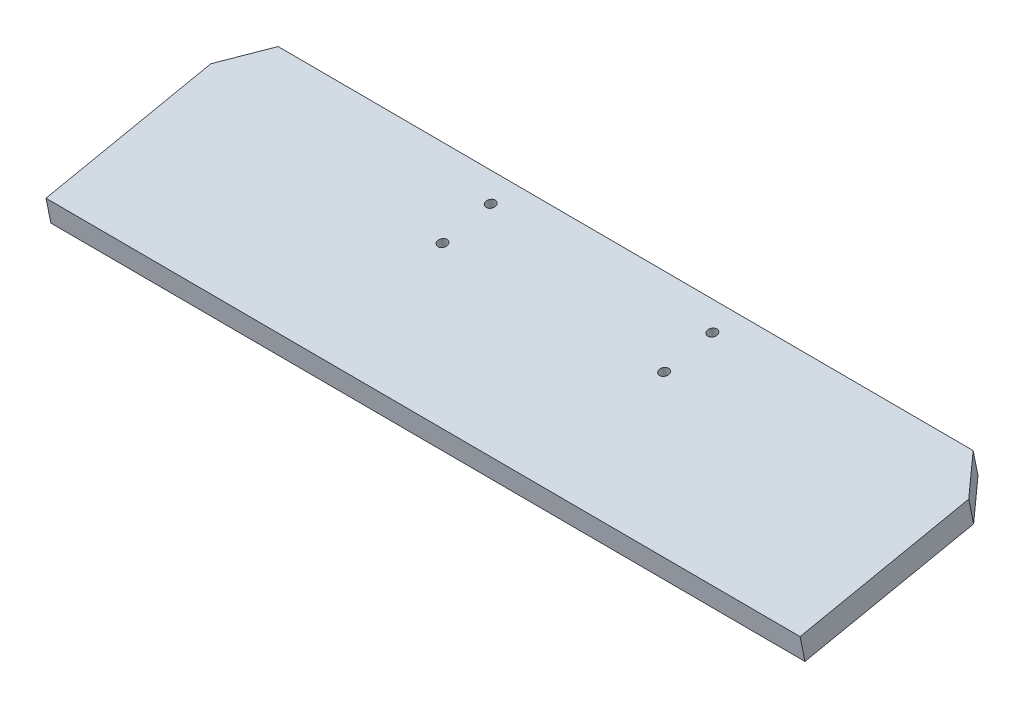
ISO-10303-21;
HEADER;
FILE_DESCRIPTION(('STEP AP214'),'2;1');
FILE_NAME('part.step','',(''),(''),'','','');
FILE_SCHEMA(('AUTOMOTIVE_DESIGN { 1 0 10303 214 1 1 1 1 }'));
ENDSEC;
DATA;
#1=APPLICATION_CONTEXT('core data for automotive mechanical design processes');
#2=APPLICATION_PROTOCOL_DEFINITION('international standard','automotive_design',2000,#1);
#3=PRODUCT_CONTEXT('',#1,'mechanical');
#4=PRODUCT('Part','Part','',(#3));
#5=PRODUCT_RELATED_PRODUCT_CATEGORY('part','',(#4));
#6=PRODUCT_DEFINITION_FORMATION('','',#4);
#7=PRODUCT_DEFINITION_CONTEXT('part definition',#1,'design');
#8=PRODUCT_DEFINITION('design','',#6,#7);
#9=PRODUCT_DEFINITION_SHAPE('','',#8);
#10=(LENGTH_UNIT() NAMED_UNIT(*) SI_UNIT(.MILLI.,.METRE.));
#11=(NAMED_UNIT(*) PLANE_ANGLE_UNIT() SI_UNIT($,.RADIAN.));
#12=(NAMED_UNIT(*) SI_UNIT($,.STERADIAN.) SOLID_ANGLE_UNIT());
#13=UNCERTAINTY_MEASURE_WITH_UNIT(LENGTH_MEASURE(1.E-05),#10,'distance_accuracy_value','');
#14=(GEOMETRIC_REPRESENTATION_CONTEXT(3) GLOBAL_UNCERTAINTY_ASSIGNED_CONTEXT((#13)) GLOBAL_UNIT_ASSIGNED_CONTEXT((#10,
#11,#12)) REPRESENTATION_CONTEXT('',''));
#15=CARTESIAN_POINT('',(0.,0.,0.));
#16=DIRECTION('',(0.,0.,1.));
#17=DIRECTION('',(1.,0.,0.));
#18=AXIS2_PLACEMENT_3D('',#15,#16,#17);
#19=CARTESIAN_POINT('',(97.422099153174,78.6378775801606,408.045001741372));
#20=DIRECTION('',(0.,0.202078468660463,-0.979369334063428));
#21=DIRECTION('',(0.,0.979369334063428,0.202078468660463));
#22=AXIS2_PLACEMENT_3D('',#19,#20,#21);
#23=PLANE('',#22);
#24=DIRECTION('',(0.999990097879295,-0.00435837437046662,-0.000899286497953613));
#25=VECTOR('',#24,1.);
#26=CARTESIAN_POINT('',(97.3938404806897,72.4189438900997,406.761816171762));
#27=LINE('',#26,#25);
#28=CARTESIAN_POINT('',(-97.0702765342321,73.266499706273,406.93669685822));
#29=VERTEX_POINT('',#28);
#30=CARTESIAN_POINT('',(97.3938404806897,72.4189438900997,406.761816171762));
#31=VERTEX_POINT('',#30);
#32=EDGE_CURVE('E119',#29,#31,#27,.T.);
#33=ORIENTED_EDGE('',*,*,#32,.T.);
#34=DIRECTION('',(-0.0044501846431965,-0.979359636230067,-0.202076467655074));
#35=VECTOR('',#34,1.);
#36=CARTESIAN_POINT('',(97.422099153174,78.6378775801606,408.045001741372));
#37=LINE('',#36,#35);
#38=CARTESIAN_POINT('',(97.422099153174,78.6378775801606,408.045001741372));
#39=VERTEX_POINT('',#38);
#40=EDGE_CURVE('E11',#39,#31,#37,.T.);
#41=ORIENTED_EDGE('',*,*,#40,.F.);
#42=DIRECTION('',(0.999990097879295,-0.00435837437046662,-0.000899286497953613));
#43=VECTOR('',#42,1.);
#44=CARTESIAN_POINT('',(97.422099153174,78.6378775801606,408.045001741372));
#45=LINE('',#44,#43);
#46=CARTESIAN_POINT('',(-97.0420178617478,79.4854333963339,408.219882427829));
#47=VERTEX_POINT('',#46);
#48=EDGE_CURVE('E130',#47,#39,#45,.T.);
#49=ORIENTED_EDGE('',*,*,#48,.F.);
#50=DIRECTION('',(-0.0044501846431965,-0.979359636230067,-0.202076467655074));
#51=VECTOR('',#50,1.);
#52=CARTESIAN_POINT('',(-97.0420178617478,79.4854333963339,408.219882427829));
#53=LINE('',#52,#51);
#54=EDGE_CURVE('E115',#47,#29,#53,.T.);
#55=ORIENTED_EDGE('',*,*,#54,.T.);
#56=EDGE_LOOP('',(#33,#41,#49,#55));
#57=FACE_BOUND('',#56,.T.);
#58=ADVANCED_FACE('F33',(#57),#23,.F.);
#59=CARTESIAN_POINT('',(97.422099153174,78.6378775801606,408.045001741372));
#60=DIRECTION('',(-0.999990097879295,0.00435837437046665,0.000899286497953456));
#61=DIRECTION('',(-0.00435837613281171,-0.999990502233639,0.));
#62=AXIS2_PLACEMENT_3D('',#59,#60,#61);
#63=PLANE('',#62);
#64=DIRECTION('',(0.,0.202078468660462,-0.979369334063428));
#65=VECTOR('',#64,1.);
#66=CARTESIAN_POINT('',(97.3938404806897,72.4189438900997,406.761816171762));
#67=LINE('',#66,#65);
#68=CARTESIAN_POINT('',(97.3938404806897,81.4013318220573,363.228849272643));
#69=VERTEX_POINT('',#68);
#70=EDGE_CURVE('E122',#31,#69,#67,.T.);
#71=ORIENTED_EDGE('',*,*,#70,.T.);
#72=DIRECTION('',(-0.0044501846431965,-0.979359636230067,-0.202076467655074));
#73=VECTOR('',#72,1.);
#74=CARTESIAN_POINT('',(97.422099153174,87.6202655121182,364.512034842252));
#75=LINE('',#74,#73);
#76=CARTESIAN_POINT('',(97.422099153174,87.6202655121182,364.512034842252));
#77=VERTEX_POINT('',#76);
#78=EDGE_CURVE('E42',#77,#69,#75,.T.);
#79=ORIENTED_EDGE('',*,*,#78,.F.);
#80=DIRECTION('',(0.,0.202078468660462,-0.979369334063428));
#81=VECTOR('',#80,1.);
#82=CARTESIAN_POINT('',(97.422099153174,78.6378775801606,408.045001741372));
#83=LINE('',#82,#81);
#84=EDGE_CURVE('E88',#39,#77,#83,.T.);
#85=ORIENTED_EDGE('',*,*,#84,.F.);
#86=ORIENTED_EDGE('',*,*,#40,.T.);
#87=EDGE_LOOP('',(#71,#79,#85,#86));
#88=FACE_BOUND('',#87,.T.);
#89=ADVANCED_FACE('F162',(#88),#63,.F.);
#90=CARTESIAN_POINT('',(97.422099153174,87.6202655121182,364.512034842252));
#91=DIRECTION('',(-0.757621319258177,-0.128591688377846,0.63990164422795));
#92=DIRECTION('',(0.645258825539128,0.,0.763964035844532));
#93=AXIS2_PLACEMENT_3D('',#90,#91,#92);
#94=PLANE('',#93);
#95=DIRECTION('',(-0.652679195671304,0.155945120486169,-0.74141148287197));
#96=VECTOR('',#95,1.);
#97=CARTESIAN_POINT('',(97.3938404806897,81.4013318220573,363.228849272643));
#98=LINE('',#97,#96);
#99=CARTESIAN_POINT('',(89.1048146956641,83.3818348522316,353.812923440169));
#100=VERTEX_POINT('',#99);
#101=EDGE_CURVE('E125',#69,#100,#98,.T.);
#102=ORIENTED_EDGE('',*,*,#101,.T.);
#103=DIRECTION('',(-0.0044501846431965,-0.979359636230067,-0.202076467655074));
#104=VECTOR('',#103,1.);
#105=CARTESIAN_POINT('',(89.1330733681484,89.6007685422925,355.096109009778));
#106=LINE('',#105,#104);
#107=CARTESIAN_POINT('',(89.1330733681484,89.6007685422925,355.096109009778));
#108=VERTEX_POINT('',#107);
#109=EDGE_CURVE('E110',#108,#100,#106,.T.);
#110=ORIENTED_EDGE('',*,*,#109,.F.);
#111=DIRECTION('',(-0.652679195671304,0.155945120486169,-0.74141148287197));
#112=VECTOR('',#111,1.);
#113=CARTESIAN_POINT('',(97.422099153174,87.6202655121182,364.512034842252));
#114=LINE('',#113,#112);
#115=EDGE_CURVE('E101',#77,#108,#114,.T.);
#116=ORIENTED_EDGE('',*,*,#115,.F.);
#117=ORIENTED_EDGE('',*,*,#78,.T.);
#118=EDGE_LOOP('',(#102,#110,#116,#117));
#119=FACE_BOUND('',#118,.T.);
#120=ADVANCED_FACE('F165',(#119),#94,.F.);
#121=CARTESIAN_POINT('',(89.1330733681484,89.6007685422925,355.096109009778));
#122=DIRECTION('',(0.,-0.202078468660463,0.979369334063428));
#123=DIRECTION('',(0.,-0.979369334063428,-0.202078468660463));
#124=AXIS2_PLACEMENT_3D('',#121,#122,#123);
#125=PLANE('',#124);
#126=DIRECTION('',(-0.999990097879295,0.00435837437046663,0.000899286497953437));
#127=VECTOR('',#126,1.);
#128=CARTESIAN_POINT('',(89.1048146956641,83.3818348522316,353.812923440169));
#129=LINE('',#128,#127);
#130=CARTESIAN_POINT('',(-90.1246620164566,84.1629917450757,353.974103684637));
#131=VERTEX_POINT('',#130);
#132=EDGE_CURVE('E109',#100,#131,#129,.T.);
#133=ORIENTED_EDGE('',*,*,#132,.T.);
#134=DIRECTION('',(-0.0044501846431965,-0.979359636230067,-0.202076467655074));
#135=VECTOR('',#134,1.);
#136=CARTESIAN_POINT('',(-90.0964033439723,90.3819254351366,355.257289254247));
#137=LINE('',#136,#135);
#138=CARTESIAN_POINT('',(-90.0964033439723,90.3819254351366,355.257289254247));
#139=VERTEX_POINT('',#138);
#140=EDGE_CURVE('E106',#139,#131,#137,.T.);
#141=ORIENTED_EDGE('',*,*,#140,.F.);
#142=DIRECTION('',(-0.999990097879295,0.00435837437046663,0.000899286497953437));
#143=VECTOR('',#142,1.);
#144=CARTESIAN_POINT('',(89.1330733681484,89.6007685422925,355.096109009778));
#145=LINE('',#144,#143);
#146=EDGE_CURVE('E95',#108,#139,#145,.T.);
#147=ORIENTED_EDGE('',*,*,#146,.F.);
#148=ORIENTED_EDGE('',*,*,#109,.T.);
#149=EDGE_LOOP('',(#133,#141,#147,#148));
#150=FACE_BOUND('',#149,.T.);
#151=ADVANCED_FACE('F107',(#150),#125,.F.);
#152=CARTESIAN_POINT('',(-97.0420178617478,88.2636224531486,365.676561371193));
#153=DIRECTION('',(0.837186908209258,-0.114166372615275,0.534868320324633));
#154=DIRECTION('',(0.538388495632697,0.,-0.842696759083813));
#155=AXIS2_PLACEMENT_3D('',#152,#153,#154);
#156=PLANE('',#155);
#157=DIRECTION('',(-0.546898780927207,-0.166795510392757,0.820415127318575));
#158=VECTOR('',#157,1.);
#159=CARTESIAN_POINT('',(-97.0702765342321,82.0446887630877,364.393375801583));
#160=LINE('',#159,#158);
#161=CARTESIAN_POINT('',(-97.0702765342321,82.0446887630877,364.393375801583));
#162=VERTEX_POINT('',#161);
#163=EDGE_CURVE('E74',#131,#162,#160,.T.);
#164=ORIENTED_EDGE('',*,*,#163,.T.);
#165=DIRECTION('',(-0.0044501846431965,-0.979359636230067,-0.202076467655074));
#166=VECTOR('',#165,1.);
#167=CARTESIAN_POINT('',(-97.0420178617478,88.2636224531486,365.676561371193));
#168=LINE('',#167,#166);
#169=CARTESIAN_POINT('',(-97.0420178617478,88.2636224531486,365.676561371193));
#170=VERTEX_POINT('',#169);
#171=EDGE_CURVE('E111',#170,#162,#168,.T.);
#172=ORIENTED_EDGE('',*,*,#171,.F.);
#173=DIRECTION('',(-0.546898780927207,-0.166795510392757,0.820415127318575));
#174=VECTOR('',#173,1.);
#175=CARTESIAN_POINT('',(-97.0420178617478,88.2636224531486,365.676561371193));
#176=LINE('',#175,#174);
#177=EDGE_CURVE('E99',#139,#170,#176,.T.);
#178=ORIENTED_EDGE('',*,*,#177,.F.);
#179=ORIENTED_EDGE('',*,*,#140,.T.);
#180=EDGE_LOOP('',(#164,#172,#178,#179));
#181=FACE_BOUND('',#180,.T.);
#182=ADVANCED_FACE('F113',(#181),#156,.F.);
#183=CARTESIAN_POINT('',(-97.0420178617478,79.4854333963339,408.219882427829));
#184=DIRECTION('',(0.999990097879295,-0.00435837437046672,-0.000899286497953144));
#185=DIRECTION('',(0.00435837613281178,0.999990502233639,0.));
#186=AXIS2_PLACEMENT_3D('',#183,#184,#185);
#187=PLANE('',#186);
#188=DIRECTION('',(0.,-0.202078468660463,0.979369334063428));
#189=VECTOR('',#188,1.);
#190=CARTESIAN_POINT('',(-97.0702765342321,73.266499706273,406.93669685822));
#191=LINE('',#190,#189);
#192=EDGE_CURVE('E80',#162,#29,#191,.T.);
#193=ORIENTED_EDGE('',*,*,#192,.T.);
#194=ORIENTED_EDGE('',*,*,#54,.F.);
#195=DIRECTION('',(0.,-0.202078468660463,0.979369334063428));
#196=VECTOR('',#195,1.);
#197=CARTESIAN_POINT('',(-97.0420178617478,79.4854333963339,408.219882427829));
#198=LINE('',#197,#196);
#199=EDGE_CURVE('E51',#170,#47,#198,.T.);
#200=ORIENTED_EDGE('',*,*,#199,.F.);
#201=ORIENTED_EDGE('',*,*,#171,.T.);
#202=EDGE_LOOP('',(#193,#194,#200,#201));
#203=FACE_BOUND('',#202,.T.);
#204=ADVANCED_FACE('F170',(#203),#187,.F.);
#205=CARTESIAN_POINT('',(-97.0420178617478,79.4854333963339,408.219882427829));
#206=DIRECTION('',(-0.0044501846431965,-0.979359636230067,-0.202076467655074));
#207=DIRECTION('',(0.,0.202078468660463,-0.979369334063428));
#208=AXIS2_PLACEMENT_3D('',#205,#206,#207);
#209=PLANE('',#208);
#210=CARTESIAN_POINT('',(-29.0563820348128,88.8326892603568,361.421391514995));
#211=DIRECTION('',(0.0044501846431965,0.979359636230067,0.202076467655074));
#212=DIRECTION('',(0.,0.202078468660463,-0.979369334063428));
#213=AXIS2_PLACEMENT_3D('',#210,#211,#212);
#214=CIRCLE('',#213,1.19062500000002);
#215=CARTESIAN_POINT('',(-29.0563820348128,89.0732889371056,360.255329901625));
#216=VERTEX_POINT('',#215);
#217=EDGE_CURVE('E154',#216,#216,#214,.T.);
#218=ORIENTED_EDGE('',*,*,#217,.F.);
#219=EDGE_LOOP('',(#218));
#220=FACE_BOUND('',#219,.T.);
#221=CARTESIAN_POINT('',(-29.0563820348128,86.2662927083689,373.8593820576));
#222=DIRECTION('',(0.0044501846431965,0.979359636230067,0.202076467655074));
#223=DIRECTION('',(0.,-0.202078468660463,0.979369334063428));
#224=AXIS2_PLACEMENT_3D('',#221,#222,#223);
#225=CIRCLE('',#224,1.19062500000002);
#226=CARTESIAN_POINT('',(-29.0563820348128,86.02569303162,375.025443670969));
#227=VERTEX_POINT('',#226);
#228=EDGE_CURVE('E144',#227,#227,#225,.T.);
#229=ORIENTED_EDGE('',*,*,#228,.F.);
#230=EDGE_LOOP('',(#229));
#231=FACE_BOUND('',#230,.T.);
#232=CARTESIAN_POINT('',(28.0930520589889,86.0172116130967,373.807987834242));
#233=DIRECTION('',(0.0044501846431965,0.979359636230067,0.202076467655074));
#234=DIRECTION('',(0.,0.202078468660463,-0.979369334063428));
#235=AXIS2_PLACEMENT_3D('',#232,#233,#234);
#236=CIRCLE('',#235,1.19062500000003);
#237=CARTESIAN_POINT('',(28.0930520589889,86.2578112898456,372.641926220873));
#238=VERTEX_POINT('',#237);
#239=EDGE_CURVE('E141',#238,#238,#236,.T.);
#240=ORIENTED_EDGE('',*,*,#239,.F.);
#241=EDGE_LOOP('',(#240));
#242=FACE_BOUND('',#241,.T.);
#243=CARTESIAN_POINT('',(28.0930520589889,88.5836081650846,361.369997291637));
#244=DIRECTION('',(0.0044501846431965,0.979359636230067,0.202076467655074));
#245=DIRECTION('',(0.,-0.202078468660463,0.979369334063428));
#246=AXIS2_PLACEMENT_3D('',#243,#244,#245);
#247=CIRCLE('',#246,1.19062500000003);
#248=CARTESIAN_POINT('',(28.0930520589889,88.3430084883357,362.536058905006));
#249=VERTEX_POINT('',#248);
#250=EDGE_CURVE('E138',#249,#249,#247,.T.);
#251=ORIENTED_EDGE('',*,*,#250,.F.);
#252=EDGE_LOOP('',(#251));
#253=FACE_BOUND('',#252,.T.);
#254=ORIENTED_EDGE('',*,*,#48,.T.);
#255=ORIENTED_EDGE('',*,*,#84,.T.);
#256=ORIENTED_EDGE('',*,*,#115,.T.);
#257=ORIENTED_EDGE('',*,*,#146,.T.);
#258=ORIENTED_EDGE('',*,*,#177,.T.);
#259=ORIENTED_EDGE('',*,*,#199,.T.);
#260=EDGE_LOOP('',(#254,#255,#256,#257,#258,#259));
#261=FACE_BOUND('',#260,.T.);
#262=ADVANCED_FACE('F97',(#220,#231,#242,#253,#261),#209,.F.);
#263=CARTESIAN_POINT('',(-97.0702765342321,73.266499706273,406.93669685822));
#264=DIRECTION('',(-0.0044501846431965,-0.979359636230067,-0.202076467655074));
#265=DIRECTION('',(0.,0.202078468660463,-0.979369334063428));
#266=AXIS2_PLACEMENT_3D('',#263,#264,#265);
#267=PLANE('',#266);
#268=CARTESIAN_POINT('',(-29.0846407072971,82.6137555702958,360.138205945385));
#269=DIRECTION('',(-0.0044501846431965,-0.979359636230067,-0.202076467655074));
#270=DIRECTION('',(0.,0.202078468660463,-0.979369334063428));
#271=AXIS2_PLACEMENT_3D('',#268,#269,#270);
#272=CIRCLE('',#271,1.19062500000002);
#273=CARTESIAN_POINT('',(-29.0846407072971,82.8543552470447,358.972144332016));
#274=VERTEX_POINT('',#273);
#275=EDGE_CURVE('E36',#274,#274,#272,.T.);
#276=ORIENTED_EDGE('',*,*,#275,.F.);
#277=EDGE_LOOP('',(#276));
#278=FACE_BOUND('',#277,.T.);
#279=CARTESIAN_POINT('',(-29.0846407072971,80.0473590183079,372.57619648799));
#280=DIRECTION('',(-0.0044501846431965,-0.979359636230067,-0.202076467655074));
#281=DIRECTION('',(0.,0.202078468660463,-0.979369334063428));
#282=AXIS2_PLACEMENT_3D('',#279,#280,#281);
#283=CIRCLE('',#282,1.19062500000002);
#284=CARTESIAN_POINT('',(-29.0846407072971,80.2879586950568,371.410134874621));
#285=VERTEX_POINT('',#284);
#286=EDGE_CURVE('E142',#285,#285,#283,.T.);
#287=ORIENTED_EDGE('',*,*,#286,.F.);
#288=EDGE_LOOP('',(#287));
#289=FACE_BOUND('',#288,.T.);
#290=CARTESIAN_POINT('',(28.0647933865046,79.7982779230358,372.524802264632));
#291=DIRECTION('',(-0.0044501846431965,-0.979359636230067,-0.202076467655074));
#292=DIRECTION('',(0.,0.202078468660463,-0.979369334063428));
#293=AXIS2_PLACEMENT_3D('',#290,#291,#292);
#294=CIRCLE('',#293,1.19062500000003);
#295=CARTESIAN_POINT('',(28.0647933865046,80.0388775997846,371.358740651263));
#296=VERTEX_POINT('',#295);
#297=EDGE_CURVE('E139',#296,#296,#294,.T.);
#298=ORIENTED_EDGE('',*,*,#297,.F.);
#299=EDGE_LOOP('',(#298));
#300=FACE_BOUND('',#299,.T.);
#301=CARTESIAN_POINT('',(28.0647933865046,82.3646744750237,360.086811722027));
#302=DIRECTION('',(-0.0044501846431965,-0.979359636230067,-0.202076467655074));
#303=DIRECTION('',(0.,0.202078468660463,-0.979369334063428));
#304=AXIS2_PLACEMENT_3D('',#301,#302,#303);
#305=CIRCLE('',#304,1.19062500000003);
#306=CARTESIAN_POINT('',(28.0647933865046,82.6052741517725,358.920750108658));
#307=VERTEX_POINT('',#306);
#308=EDGE_CURVE('E123',#307,#307,#305,.T.);
#309=ORIENTED_EDGE('',*,*,#308,.F.);
#310=EDGE_LOOP('',(#309));
#311=FACE_BOUND('',#310,.T.);
#312=ORIENTED_EDGE('',*,*,#32,.F.);
#313=ORIENTED_EDGE('',*,*,#192,.F.);
#314=ORIENTED_EDGE('',*,*,#163,.F.);
#315=ORIENTED_EDGE('',*,*,#132,.F.);
#316=ORIENTED_EDGE('',*,*,#101,.F.);
#317=ORIENTED_EDGE('',*,*,#70,.F.);
#318=EDGE_LOOP('',(#312,#313,#314,#315,#316,#317));
#319=FACE_BOUND('',#318,.T.);
#320=ADVANCED_FACE('F168',(#278,#289,#300,#311,#319),#267,.T.);
#321=CARTESIAN_POINT('',(28.0133264384397,71.0382564550808,357.749771823726));
#322=DIRECTION('',(0.0044501846431965,0.979359636230067,0.202076467655074));
#323=DIRECTION('',(0.,-0.202078468660463,0.979369334063428));
#324=AXIS2_PLACEMENT_3D('',#321,#322,#323);
#325=CYLINDRICAL_SURFACE('',#324,1.19062500000003);
#326=ORIENTED_EDGE('',*,*,#308,.T.);
#327=EDGE_LOOP('',(#326));
#328=FACE_BOUND('',#327,.T.);
#329=ORIENTED_EDGE('',*,*,#250,.T.);
#330=EDGE_LOOP('',(#329));
#331=FACE_BOUND('',#330,.T.);
#332=ADVANCED_FACE('F215',(#328,#331),#325,.F.);
#333=CARTESIAN_POINT('',(28.0133264384397,68.4718599030929,370.187762366332));
#334=DIRECTION('',(0.0044501846431965,0.979359636230067,0.202076467655074));
#335=DIRECTION('',(0.,-0.202078468660463,0.979369334063428));
#336=AXIS2_PLACEMENT_3D('',#333,#334,#335);
#337=CYLINDRICAL_SURFACE('',#336,1.19062500000003);
#338=ORIENTED_EDGE('',*,*,#297,.T.);
#339=EDGE_LOOP('',(#338));
#340=FACE_BOUND('',#339,.T.);
#341=ORIENTED_EDGE('',*,*,#239,.T.);
#342=EDGE_LOOP('',(#341));
#343=FACE_BOUND('',#342,.T.);
#344=ADVANCED_FACE('F223',(#340,#343),#337,.F.);
#345=CARTESIAN_POINT('',(-29.136107655362,68.7209409983651,370.23915658969));
#346=DIRECTION('',(0.0044501846431965,0.979359636230067,0.202076467655074));
#347=DIRECTION('',(0.,-0.202078468660463,0.979369334063428));
#348=AXIS2_PLACEMENT_3D('',#345,#346,#347);
#349=CYLINDRICAL_SURFACE('',#348,1.19062500000002);
#350=ORIENTED_EDGE('',*,*,#286,.T.);
#351=EDGE_LOOP('',(#350));
#352=FACE_BOUND('',#351,.T.);
#353=ORIENTED_EDGE('',*,*,#228,.T.);
#354=EDGE_LOOP('',(#353));
#355=FACE_BOUND('',#354,.T.);
#356=ADVANCED_FACE('F233',(#352,#355),#349,.F.);
#357=CARTESIAN_POINT('',(-29.136107655362,71.287337550353,357.801166047084));
#358=DIRECTION('',(0.0044501846431965,0.979359636230067,0.202076467655074));
#359=DIRECTION('',(0.,-0.202078468660463,0.979369334063428));
#360=AXIS2_PLACEMENT_3D('',#357,#358,#359);
#361=CYLINDRICAL_SURFACE('',#360,1.19062500000002);
#362=ORIENTED_EDGE('',*,*,#275,.T.);
#363=EDGE_LOOP('',(#362));
#364=FACE_BOUND('',#363,.T.);
#365=ORIENTED_EDGE('',*,*,#217,.T.);
#366=EDGE_LOOP('',(#365));
#367=FACE_BOUND('',#366,.T.);
#368=ADVANCED_FACE('F243',(#364,#367),#361,.F.);
#369=CLOSED_SHELL('',(#58,#89,#120,#151,#182,#204,#262,#320,#332,#344,#356,#368));
#370=MANIFOLD_SOLID_BREP('B2',#369);
#371=ADVANCED_BREP_SHAPE_REPRESENTATION('',(#18,#370),#14);
#372=SHAPE_DEFINITION_REPRESENTATION(#9,#371);
ENDSEC;
END-ISO-10303-21;
